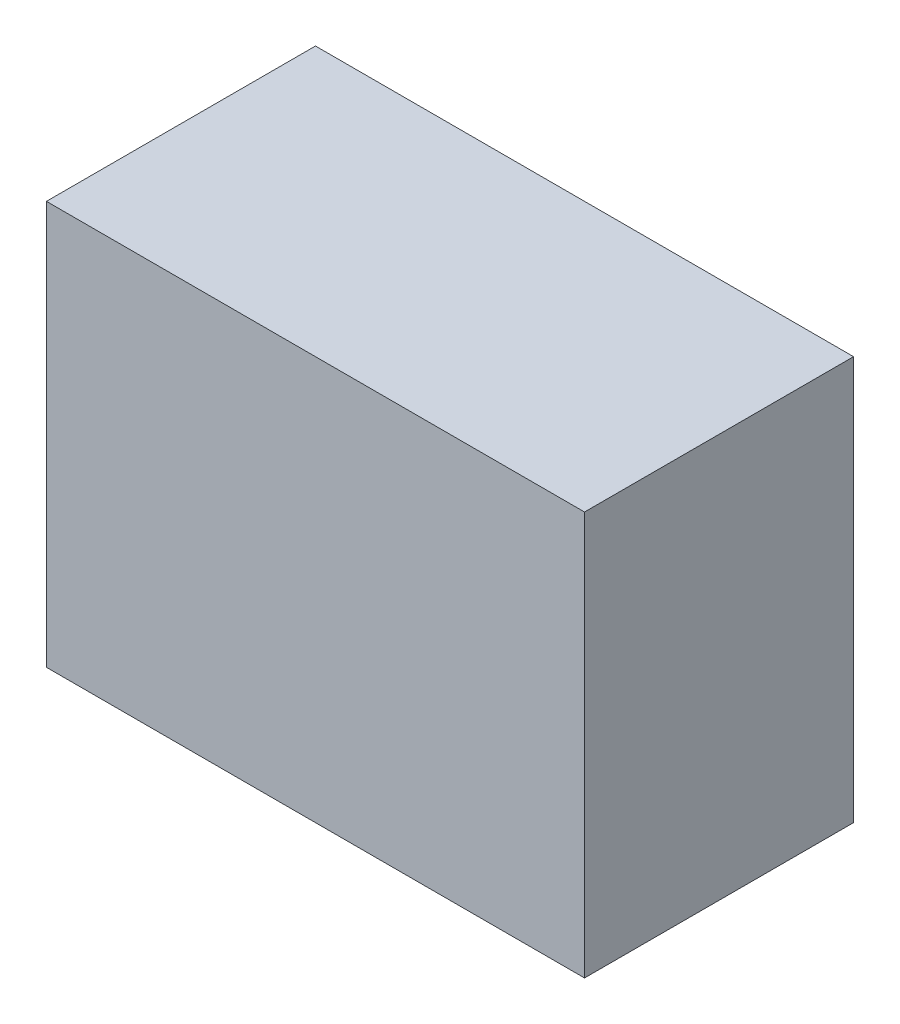
ISO-10303-21;
HEADER;
FILE_DESCRIPTION(('STEP AP214'),'2;1');
FILE_NAME('part.step','',(''),(''),'','','');
FILE_SCHEMA(('AUTOMOTIVE_DESIGN { 1 0 10303 214 1 1 1 1 }'));
ENDSEC;
DATA;
#1=APPLICATION_CONTEXT('core data for automotive mechanical design processes');
#2=APPLICATION_PROTOCOL_DEFINITION('international standard','automotive_design',2000,#1);
#3=PRODUCT_CONTEXT('',#1,'mechanical');
#4=PRODUCT('Part','Part','',(#3));
#5=PRODUCT_RELATED_PRODUCT_CATEGORY('part','',(#4));
#6=PRODUCT_DEFINITION_FORMATION('','',#4);
#7=PRODUCT_DEFINITION_CONTEXT('part definition',#1,'design');
#8=PRODUCT_DEFINITION('design','',#6,#7);
#9=PRODUCT_DEFINITION_SHAPE('','',#8);
#10=(LENGTH_UNIT() NAMED_UNIT(*) SI_UNIT(.MILLI.,.METRE.));
#11=(NAMED_UNIT(*) PLANE_ANGLE_UNIT() SI_UNIT($,.RADIAN.));
#12=(NAMED_UNIT(*) SI_UNIT($,.STERADIAN.) SOLID_ANGLE_UNIT());
#13=UNCERTAINTY_MEASURE_WITH_UNIT(LENGTH_MEASURE(1.E-05),#10,'distance_accuracy_value','');
#14=(GEOMETRIC_REPRESENTATION_CONTEXT(3) GLOBAL_UNCERTAINTY_ASSIGNED_CONTEXT((#13)) GLOBAL_UNIT_ASSIGNED_CONTEXT((#10,
#11,#12)) REPRESENTATION_CONTEXT('',''));
#15=CARTESIAN_POINT('',(0.,0.,0.));
#16=DIRECTION('',(0.,0.,1.));
#17=DIRECTION('',(1.,0.,0.));
#18=AXIS2_PLACEMENT_3D('',#15,#16,#17);
#19=CARTESIAN_POINT('',(0.,0.,200.));
#20=DIRECTION('',(1.,0.,0.));
#21=DIRECTION('',(0.,0.,-1.));
#22=AXIS2_PLACEMENT_3D('',#19,#20,#21);
#23=PLANE('',#22);
#24=DIRECTION('',(0.,-1.,0.));
#25=VECTOR('',#24,1.);
#26=CARTESIAN_POINT('',(0.,0.,0.));
#27=LINE('',#26,#25);
#28=CARTESIAN_POINT('',(0.,300.,0.));
#29=VERTEX_POINT('',#28);
#30=CARTESIAN_POINT('',(0.,0.,0.));
#31=VERTEX_POINT('',#30);
#32=EDGE_CURVE('E97',#29,#31,#27,.T.);
#33=ORIENTED_EDGE('',*,*,#32,.T.);
#34=DIRECTION('',(0.,0.,-1.));
#35=VECTOR('',#34,1.);
#36=CARTESIAN_POINT('',(0.,0.,200.));
#37=LINE('',#36,#35);
#38=CARTESIAN_POINT('',(0.,0.,200.));
#39=VERTEX_POINT('',#38);
#40=EDGE_CURVE('E11',#39,#31,#37,.T.);
#41=ORIENTED_EDGE('',*,*,#40,.F.);
#42=DIRECTION('',(0.,-1.,0.));
#43=VECTOR('',#42,1.);
#44=CARTESIAN_POINT('',(0.,0.,200.));
#45=LINE('',#44,#43);
#46=CARTESIAN_POINT('',(0.,300.,200.));
#47=VERTEX_POINT('',#46);
#48=EDGE_CURVE('E85',#47,#39,#45,.T.);
#49=ORIENTED_EDGE('',*,*,#48,.F.);
#50=DIRECTION('',(0.,0.,-1.));
#51=VECTOR('',#50,1.);
#52=CARTESIAN_POINT('',(0.,300.,200.));
#53=LINE('',#52,#51);
#54=EDGE_CURVE('E93',#47,#29,#53,.T.);
#55=ORIENTED_EDGE('',*,*,#54,.T.);
#56=EDGE_LOOP('',(#33,#41,#49,#55));
#57=FACE_BOUND('',#56,.T.);
#58=ADVANCED_FACE('F34',(#57),#23,.F.);
#59=CARTESIAN_POINT('',(0.,0.,200.));
#60=DIRECTION('',(0.,1.,0.));
#61=DIRECTION('',(0.,0.,1.));
#62=AXIS2_PLACEMENT_3D('',#59,#60,#61);
#63=PLANE('',#62);
#64=DIRECTION('',(1.,0.,0.));
#65=VECTOR('',#64,1.);
#66=CARTESIAN_POINT('',(0.,0.,0.));
#67=LINE('',#66,#65);
#68=CARTESIAN_POINT('',(400.,0.,0.));
#69=VERTEX_POINT('',#68);
#70=EDGE_CURVE('E89',#31,#69,#67,.T.);
#71=ORIENTED_EDGE('',*,*,#70,.T.);
#72=DIRECTION('',(0.,0.,-1.));
#73=VECTOR('',#72,1.);
#74=CARTESIAN_POINT('',(400.,0.,200.));
#75=LINE('',#74,#73);
#76=CARTESIAN_POINT('',(400.,0.,200.));
#77=VERTEX_POINT('',#76);
#78=EDGE_CURVE('E42',#77,#69,#75,.T.);
#79=ORIENTED_EDGE('',*,*,#78,.F.);
#80=DIRECTION('',(1.,0.,0.));
#81=VECTOR('',#80,1.);
#82=CARTESIAN_POINT('',(0.,0.,200.));
#83=LINE('',#82,#81);
#84=EDGE_CURVE('E80',#39,#77,#83,.T.);
#85=ORIENTED_EDGE('',*,*,#84,.F.);
#86=ORIENTED_EDGE('',*,*,#40,.T.);
#87=EDGE_LOOP('',(#71,#79,#85,#86));
#88=FACE_BOUND('',#87,.T.);
#89=ADVANCED_FACE('F88',(#88),#63,.F.);
#90=CARTESIAN_POINT('',(400.,0.,200.));
#91=DIRECTION('',(-1.,0.,0.));
#92=DIRECTION('',(0.,0.,1.));
#93=AXIS2_PLACEMENT_3D('',#90,#91,#92);
#94=PLANE('',#93);
#95=DIRECTION('',(0.,1.,0.));
#96=VECTOR('',#95,1.);
#97=CARTESIAN_POINT('',(400.,0.,0.));
#98=LINE('',#97,#96);
#99=CARTESIAN_POINT('',(400.,300.,0.));
#100=VERTEX_POINT('',#99);
#101=EDGE_CURVE('E67',#69,#100,#98,.T.);
#102=ORIENTED_EDGE('',*,*,#101,.T.);
#103=DIRECTION('',(0.,0.,-1.));
#104=VECTOR('',#103,1.);
#105=CARTESIAN_POINT('',(400.,300.,200.));
#106=LINE('',#105,#104);
#107=CARTESIAN_POINT('',(400.,300.,200.));
#108=VERTEX_POINT('',#107);
#109=EDGE_CURVE('E90',#108,#100,#106,.T.);
#110=ORIENTED_EDGE('',*,*,#109,.F.);
#111=DIRECTION('',(0.,1.,0.));
#112=VECTOR('',#111,1.);
#113=CARTESIAN_POINT('',(400.,0.,200.));
#114=LINE('',#113,#112);
#115=EDGE_CURVE('E83',#77,#108,#114,.T.);
#116=ORIENTED_EDGE('',*,*,#115,.F.);
#117=ORIENTED_EDGE('',*,*,#78,.T.);
#118=EDGE_LOOP('',(#102,#110,#116,#117));
#119=FACE_BOUND('',#118,.T.);
#120=ADVANCED_FACE('F91',(#119),#94,.F.);
#121=CARTESIAN_POINT('',(0.,300.,200.));
#122=DIRECTION('',(0.,-1.,0.));
#123=DIRECTION('',(0.,0.,-1.));
#124=AXIS2_PLACEMENT_3D('',#121,#122,#123);
#125=PLANE('',#124);
#126=DIRECTION('',(-1.,0.,0.));
#127=VECTOR('',#126,1.);
#128=CARTESIAN_POINT('',(0.,300.,0.));
#129=LINE('',#128,#127);
#130=EDGE_CURVE('E73',#100,#29,#129,.T.);
#131=ORIENTED_EDGE('',*,*,#130,.T.);
#132=ORIENTED_EDGE('',*,*,#54,.F.);
#133=DIRECTION('',(-1.,0.,0.));
#134=VECTOR('',#133,1.);
#135=CARTESIAN_POINT('',(0.,300.,200.));
#136=LINE('',#135,#134);
#137=EDGE_CURVE('E50',#108,#47,#136,.T.);
#138=ORIENTED_EDGE('',*,*,#137,.F.);
#139=ORIENTED_EDGE('',*,*,#109,.T.);
#140=EDGE_LOOP('',(#131,#132,#138,#139));
#141=FACE_BOUND('',#140,.T.);
#142=ADVANCED_FACE('F104',(#141),#125,.F.);
#143=CARTESIAN_POINT('',(0.,0.,200.));
#144=DIRECTION('',(0.,0.,-1.));
#145=DIRECTION('',(-1.,0.,0.));
#146=AXIS2_PLACEMENT_3D('',#143,#144,#145);
#147=PLANE('',#146);
#148=ORIENTED_EDGE('',*,*,#48,.T.);
#149=ORIENTED_EDGE('',*,*,#84,.T.);
#150=ORIENTED_EDGE('',*,*,#115,.T.);
#151=ORIENTED_EDGE('',*,*,#137,.T.);
#152=EDGE_LOOP('',(#148,#149,#150,#151));
#153=FACE_BOUND('',#152,.T.);
#154=ADVANCED_FACE('F81',(#153),#147,.F.);
#155=CARTESIAN_POINT('',(0.,0.,0.));
#156=DIRECTION('',(0.,0.,-1.));
#157=DIRECTION('',(-1.,0.,0.));
#158=AXIS2_PLACEMENT_3D('',#155,#156,#157);
#159=PLANE('',#158);
#160=ORIENTED_EDGE('',*,*,#32,.F.);
#161=ORIENTED_EDGE('',*,*,#130,.F.);
#162=ORIENTED_EDGE('',*,*,#101,.F.);
#163=ORIENTED_EDGE('',*,*,#70,.F.);
#164=EDGE_LOOP('',(#160,#161,#162,#163));
#165=FACE_BOUND('',#164,.T.);
#166=ADVANCED_FACE('F107',(#165),#159,.T.);
#167=CLOSED_SHELL('',(#58,#89,#120,#142,#154,#166));
#168=MANIFOLD_SOLID_BREP('B2',#167);
#169=ADVANCED_BREP_SHAPE_REPRESENTATION('',(#18,#168),#14);
#170=SHAPE_DEFINITION_REPRESENTATION(#9,#169);
ENDSEC;
END-ISO-10303-21;
